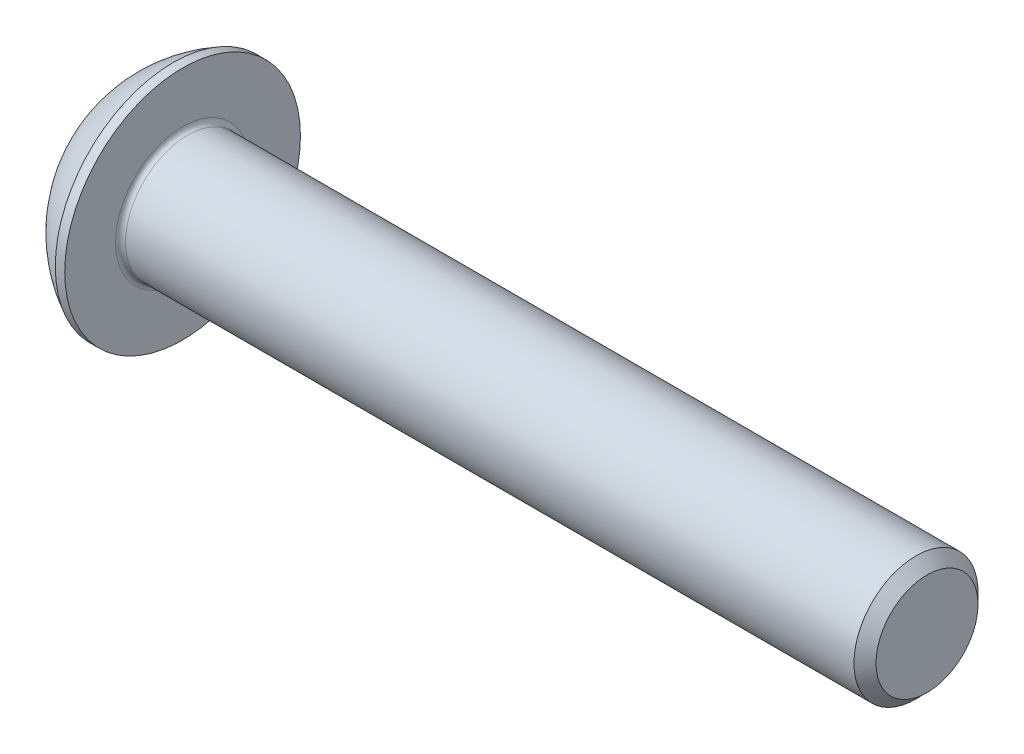
ISO-10303-21;
HEADER;
FILE_DESCRIPTION(('STEP AP214'),'2;1');
FILE_NAME('part.step','',(''),(''),'','','');
FILE_SCHEMA(('AUTOMOTIVE_DESIGN { 1 0 10303 214 1 1 1 1 }'));
ENDSEC;
DATA;
#1=APPLICATION_CONTEXT('core data for automotive mechanical design processes');
#2=APPLICATION_PROTOCOL_DEFINITION('international standard','automotive_design',2000,#1);
#3=PRODUCT_CONTEXT('',#1,'mechanical');
#4=PRODUCT('Part','Part','',(#3));
#5=PRODUCT_RELATED_PRODUCT_CATEGORY('part','',(#4));
#6=PRODUCT_DEFINITION_FORMATION('','',#4);
#7=PRODUCT_DEFINITION_CONTEXT('part definition',#1,'design');
#8=PRODUCT_DEFINITION('design','',#6,#7);
#9=PRODUCT_DEFINITION_SHAPE('','',#8);
#10=(LENGTH_UNIT() NAMED_UNIT(*) SI_UNIT(.MILLI.,.METRE.));
#11=(NAMED_UNIT(*) PLANE_ANGLE_UNIT() SI_UNIT($,.RADIAN.));
#12=(NAMED_UNIT(*) SI_UNIT($,.STERADIAN.) SOLID_ANGLE_UNIT());
#13=UNCERTAINTY_MEASURE_WITH_UNIT(LENGTH_MEASURE(1.E-05),#10,'distance_accuracy_value','');
#14=(GEOMETRIC_REPRESENTATION_CONTEXT(3) GLOBAL_UNCERTAINTY_ASSIGNED_CONTEXT((#13)) GLOBAL_UNIT_ASSIGNED_CONTEXT((#10,
#11,#12)) REPRESENTATION_CONTEXT('',''));
#15=CARTESIAN_POINT('',(0.,0.,0.));
#16=DIRECTION('',(0.,0.,1.));
#17=DIRECTION('',(1.,0.,0.));
#18=AXIS2_PLACEMENT_3D('',#15,#16,#17);
#19=CARTESIAN_POINT('',(0.,0.,0.));
#20=DIRECTION('',(-1.,0.,0.));
#21=DIRECTION('',(0.,0.,1.));
#22=AXIS2_PLACEMENT_3D('',#19,#20,#21);
#23=PLANE('',#22);
#24=CARTESIAN_POINT('',(0.,0.,0.));
#25=DIRECTION('',(-1.,0.,0.));
#26=DIRECTION('',(0.,0.,1.));
#27=AXIS2_PLACEMENT_3D('',#24,#25,#26);
#28=CIRCLE('',#27,2.375);
#29=CARTESIAN_POINT('',(0.,2.375,0.));
#30=VERTEX_POINT('',#29);
#31=EDGE_CURVE('E159',#30,#30,#28,.T.);
#32=ORIENTED_EDGE('',*,*,#31,.T.);
#33=EDGE_LOOP('',(#32));
#34=FACE_BOUND('',#33,.T.);
#35=DIRECTION('',(0.,-1.,0.));
#36=VECTOR('',#35,1.);
#37=CARTESIAN_POINT('',(0.,-0.866025403784438,1.5));
#38=LINE('',#37,#36);
#39=CARTESIAN_POINT('',(0.,0.86602540378444,1.5));
#40=VERTEX_POINT('',#39);
#41=CARTESIAN_POINT('',(0.,-0.866025403784438,1.5));
#42=VERTEX_POINT('',#41);
#43=EDGE_CURVE('E54',#40,#42,#38,.T.);
#44=ORIENTED_EDGE('',*,*,#43,.T.);
#45=DIRECTION('',(0.,-0.5,-0.866025403784439));
#46=VECTOR('',#45,1.);
#47=CARTESIAN_POINT('',(0.,-1.73205080756888,0.));
#48=LINE('',#47,#46);
#49=CARTESIAN_POINT('',(0.,-1.73205080756888,0.));
#50=VERTEX_POINT('',#49);
#51=EDGE_CURVE('E279',#42,#50,#48,.T.);
#52=ORIENTED_EDGE('',*,*,#51,.T.);
#53=DIRECTION('',(0.,0.5,-0.866025403784438));
#54=VECTOR('',#53,1.);
#55=CARTESIAN_POINT('',(0.,-0.866025403784438,-1.5));
#56=LINE('',#55,#54);
#57=CARTESIAN_POINT('',(0.,-0.866025403784438,-1.5));
#58=VERTEX_POINT('',#57);
#59=EDGE_CURVE('E134',#50,#58,#56,.T.);
#60=ORIENTED_EDGE('',*,*,#59,.T.);
#61=DIRECTION('',(0.,1.,0.));
#62=VECTOR('',#61,1.);
#63=CARTESIAN_POINT('',(0.,0.86602540378444,-1.5));
#64=LINE('',#63,#62);
#65=CARTESIAN_POINT('',(0.,0.86602540378444,-1.5));
#66=VERTEX_POINT('',#65);
#67=EDGE_CURVE('E282',#58,#66,#64,.T.);
#68=ORIENTED_EDGE('',*,*,#67,.T.);
#69=DIRECTION('',(0.,0.5,0.866025403784439));
#70=VECTOR('',#69,1.);
#71=CARTESIAN_POINT('',(0.,1.73205080756888,0.));
#72=LINE('',#71,#70);
#73=CARTESIAN_POINT('',(0.,1.73205080756888,0.));
#74=VERTEX_POINT('',#73);
#75=EDGE_CURVE('E284',#66,#74,#72,.T.);
#76=ORIENTED_EDGE('',*,*,#75,.T.);
#77=DIRECTION('',(0.,-0.5,0.866025403784439));
#78=VECTOR('',#77,1.);
#79=CARTESIAN_POINT('',(0.,0.86602540378444,1.5));
#80=LINE('',#79,#78);
#81=EDGE_CURVE('E286',#74,#40,#80,.T.);
#82=ORIENTED_EDGE('',*,*,#81,.T.);
#83=EDGE_LOOP('',(#44,#52,#60,#68,#76,#82));
#84=FACE_BOUND('',#83,.T.);
#85=ADVANCED_FACE('F39',(#34,#84),#23,.T.);
#86=CARTESIAN_POINT('',(4.75501582278481,0.,0.));
#87=DIRECTION('',(-1.,0.,0.));
#88=DIRECTION('',(0.,1.,0.));
#89=AXIS2_PLACEMENT_3D('',#86,#87,#88);
#90=SPHERICAL_SURFACE('',#89,5.3151482081814);
#91=CARTESIAN_POINT('',(2.37,0.,0.));
#92=DIRECTION('',(-1.,0.,0.));
#93=DIRECTION('',(0.,0.,1.));
#94=AXIS2_PLACEMENT_3D('',#91,#92,#93);
#95=CIRCLE('',#94,4.75);
#96=CARTESIAN_POINT('',(2.37,4.75,0.));
#97=VERTEX_POINT('',#96);
#98=EDGE_CURVE('E156',#97,#97,#95,.T.);
#99=CARTESIAN_POINT('',(2.37,4.75,0.));
#100=CARTESIAN_POINT('',(2.33822259048669,4.7340443473251,0.));
#101=CARTESIAN_POINT('',(2.30660534291523,4.71776971995817,0.));
#102=CARTESIAN_POINT('',(2.24370380094997,4.68458927158339,0.));
#103=CARTESIAN_POINT('',(2.21241950655618,4.66768345057554,0.));
#104=CARTESIAN_POINT('',(2.15019650024021,4.6332473706621,0.));
#105=CARTESIAN_POINT('',(2.11925778831804,4.6157171117565,0.));
#106=CARTESIAN_POINT('',(2.05773840110808,4.58003923142984,0.));
#107=CARTESIAN_POINT('',(2.02715772582028,4.56189161000878,0.));
#108=CARTESIAN_POINT('',(1.96636673145741,4.52498631044657,0.));
#109=CARTESIAN_POINT('',(1.93615641238234,4.50622863230541,0.));
#110=CARTESIAN_POINT('',(1.87611829826807,4.46811077571318,0.));
#111=CARTESIAN_POINT('',(1.84629050322888,4.4487505972621,0.));
#112=CARTESIAN_POINT('',(1.78702945162455,4.40943553782984,0.));
#113=CARTESIAN_POINT('',(1.75759619505941,4.38948065684865,0.));
#114=CARTESIAN_POINT('',(1.69913607574061,4.34898423002648,0.));
#115=CARTESIAN_POINT('',(1.67010921298694,4.32844268418548,0.));
#116=CARTESIAN_POINT('',(1.61247357298735,4.28678120152175,0.));
#117=CARTESIAN_POINT('',(1.58386479574144,4.265661264699,0.));
#118=CARTESIAN_POINT('',(1.52707685004032,4.22285150694424,0.));
#119=CARTESIAN_POINT('',(1.49889768158512,4.20116168601223,0.));
#120=CARTESIAN_POINT('',(1.44298030371049,4.15722089644741,0.));
#121=CARTESIAN_POINT('',(1.41524209429107,4.13496992781461,0.));
#122=CARTESIAN_POINT('',(1.36021780711889,4.08991580528235,0.));
#123=CARTESIAN_POINT('',(1.33293172936613,4.06711265138288,0.));
#124=CARTESIAN_POINT('',(1.278822696045,4.02096334316477,0.));
#125=CARTESIAN_POINT('',(1.25199974047662,3.99761718884614,0.));
#126=CARTESIAN_POINT('',(1.19882775550162,3.95039128335163,0.));
#127=CARTESIAN_POINT('',(1.172478726095,3.92651153217576,0.));
#128=CARTESIAN_POINT('',(1.1202652065289,3.87822805145535,0.));
#129=CARTESIAN_POINT('',(1.09440071636942,3.85382432191081,0.));
#130=CARTESIAN_POINT('',(1.04316669321618,3.8045027139941,0.));
#131=CARTESIAN_POINT('',(1.01779716022241,3.77958483562192,0.));
#132=CARTESIAN_POINT('',(0.9675632699561,3.72924496668416,0.));
#133=CARTESIAN_POINT('',(0.942698912683562,3.70382297611859,0.));
#134=CARTESIAN_POINT('',(0.89348538893628,3.65248512247887,0.));
#135=CARTESIAN_POINT('',(0.869136222461536,3.62656925940472,0.));
#136=CARTESIAN_POINT('',(0.82096288787349,3.57425409935884,0.));
#137=CARTESIAN_POINT('',(0.797138719760188,3.54785480238711,0.));
#138=CARTESIAN_POINT('',(0.750024977995378,3.49458340787865,0.));
#139=CARTESIAN_POINT('',(0.726735404343869,3.46771131034191,0.));
#140=CARTESIAN_POINT('',(0.680700232274541,3.41350513847464,0.));
#141=CARTESIAN_POINT('',(0.657954633856721,3.3861710641441,0.));
#142=CARTESIAN_POINT('',(0.613016573919583,3.33105194853939,0.));
#143=CARTESIAN_POINT('',(0.590824112400263,3.30326690726522,0.));
#144=CARTESIAN_POINT('',(0.547001265128254,3.24725704926748,0.));
#145=CARTESIAN_POINT('',(0.525370879375564,3.21903223254391,0.));
#146=CARTESIAN_POINT('',(0.48268089610549,3.16215419227901,0.));
#147=CARTESIAN_POINT('',(0.461621298588105,3.13350096873769,0.));
#148=CARTESIAN_POINT('',(0.420081374357154,3.07577765602272,0.));
#149=CARTESIAN_POINT('',(0.399601047643587,3.04670756684908,0.));
#150=CARTESIAN_POINT('',(0.359227914239947,2.98816223197683,0.));
#151=CARTESIAN_POINT('',(0.339335107549873,2.95868698627821,0.));
#152=CARTESIAN_POINT('',(0.300145026860787,2.89934321060632,0.));
#153=CARTESIAN_POINT('',(0.280847752861776,2.86947468063304,0.));
#154=CARTESIAN_POINT('',(0.242856509997139,2.80935636725696,0.));
#155=CARTESIAN_POINT('',(0.224162541131514,2.77910658385416,0.));
#156=CARTESIAN_POINT('',(0.187385439283607,2.71823794734018,0.));
#157=CARTESIAN_POINT('',(0.169302306301325,2.68761909422898,0.));
#158=CARTESIAN_POINT('',(0.133754156035989,2.626024653246,0.));
#159=CARTESIAN_POINT('',(0.116289138752934,2.59504906537422,0.));
#160=CARTESIAN_POINT('',(0.081984269005742,2.53275362391635,0.));
#161=CARTESIAN_POINT('',(0.0651444165416041,2.50143377033028,0.));
#162=CARTESIAN_POINT('',(0.03209660554443,2.43846244094735,0.));
#163=CARTESIAN_POINT('',(0.0158886470113938,2.40681096515049,0.));
#164=CARTESIAN_POINT('',(0.,2.375,0.));
#165=B_SPLINE_CURVE_WITH_KNOTS('',3,(#99,#100,#101,#102,#103,#104,#105,#106,#107,#108,#109,#110,
#111,#112,#113,#114,#115,#116,#117,#118,#119,#120,#121,#122,#123,#124,#125,#126,#127,#128,#129,
#130,#131,#132,#133,#134,#135,#136,#137,#138,#139,#140,#141,#142,#143,#144,#145,#146,#147,#148,
#149,#150,#151,#152,#153,#154,#155,#156,#157,#158,#159,#160,#161,#162,#163,#164),.UNSPECIFIED.,
.F.,.F.,(4,2,2,2,2,2,2,2,2,2,2,2,2,2,2,2,2,2,2,2,2,2,2,2,2,2,2,2,2,2,2,2,4),(0.,
0.106672849678272,0.213345699356545,0.320018549034817,0.426691398713089,0.533364248391363,
0.640037098069634,0.746709947747907,0.853382797426179,0.960055647104452,1.06672849678272,
1.173401346461,1.28007419613927,1.38674704581754,1.49341989549581,1.60009274517409,
1.70676559485236,1.81343844453063,1.9201112942089,2.02678414388718,2.13345699356545,
2.24012984324372,2.34680269292199,2.45347554260027,2.56014839227854,2.66682124195681,
2.77349409163508,2.88016694131336,2.98683979099163,3.0935126406699,3.20018549034817,
3.30685834002645,3.41353118970472),.UNSPECIFIED.);
#166=EDGE_CURVE('BSEAM180',#97,#30,#165,.T.);
#167=ORIENTED_EDGE('',*,*,#98,.T.);
#168=ORIENTED_EDGE('',*,*,#31,.F.);
#169=ORIENTED_EDGE('',*,*,#166,.T.);
#170=ORIENTED_EDGE('',*,*,#166,.F.);
#171=EDGE_LOOP('',(#167,#169,#168,#170));
#172=FACE_BOUND('',#171,.T.);
#173=ADVANCED_FACE('F180',(#172),#90,.T.);
#174=CARTESIAN_POINT('',(0.,0.,0.));
#175=DIRECTION('',(-1.,0.,0.));
#176=DIRECTION('',(0.,0.,1.));
#177=AXIS2_PLACEMENT_3D('',#174,#175,#176);
#178=CYLINDRICAL_SURFACE('',#177,4.75);
#179=ORIENTED_EDGE('',*,*,#98,.F.);
#180=EDGE_LOOP('',(#179));
#181=FACE_BOUND('',#180,.T.);
#182=CARTESIAN_POINT('',(2.75,0.,0.));
#183=DIRECTION('',(-1.,0.,0.));
#184=DIRECTION('',(0.,0.,1.));
#185=AXIS2_PLACEMENT_3D('',#182,#183,#184);
#186=CIRCLE('',#185,4.75);
#187=CARTESIAN_POINT('',(2.75,0.,4.75));
#188=VERTEX_POINT('',#187);
#189=EDGE_CURVE('E153',#188,#188,#186,.T.);
#190=ORIENTED_EDGE('',*,*,#189,.T.);
#191=EDGE_LOOP('',(#190));
#192=FACE_BOUND('',#191,.T.);
#193=ADVANCED_FACE('F185',(#181,#192),#178,.T.);
#194=CARTESIAN_POINT('',(2.75,2.49999999999999,0.));
#195=DIRECTION('',(-1.,0.,0.));
#196=DIRECTION('',(0.,0.,1.));
#197=AXIS2_PLACEMENT_3D('',#194,#195,#196);
#198=PLANE('',#197);
#199=CARTESIAN_POINT('',(2.75,0.,0.));
#200=DIRECTION('',(-1.,0.,0.));
#201=DIRECTION('',(0.,0.,1.));
#202=AXIS2_PLACEMENT_3D('',#199,#200,#201);
#203=CIRCLE('',#202,2.7);
#204=CARTESIAN_POINT('',(2.75,0.,2.7));
#205=VERTEX_POINT('',#204);
#206=EDGE_CURVE('E47',#205,#205,#203,.T.);
#207=ORIENTED_EDGE('',*,*,#206,.T.);
#208=EDGE_LOOP('',(#207));
#209=FACE_BOUND('',#208,.T.);
#210=ORIENTED_EDGE('',*,*,#189,.F.);
#211=EDGE_LOOP('',(#210));
#212=FACE_BOUND('',#211,.T.);
#213=ADVANCED_FACE('F164',(#209,#212),#198,.F.);
#214=CARTESIAN_POINT('',(0.,0.,0.));
#215=DIRECTION('',(-1.,0.,0.));
#216=DIRECTION('',(0.,0.,1.));
#217=AXIS2_PLACEMENT_3D('',#214,#215,#216);
#218=CYLINDRICAL_SURFACE('',#217,2.5);
#219=CARTESIAN_POINT('',(2.95,0.,0.));
#220=DIRECTION('',(-1.,0.,0.));
#221=DIRECTION('',(0.,0.,1.));
#222=AXIS2_PLACEMENT_3D('',#219,#220,#221);
#223=CIRCLE('',#222,2.5);
#224=CARTESIAN_POINT('',(2.95,0.,2.5));
#225=VERTEX_POINT('',#224);
#226=EDGE_CURVE('E11',#225,#225,#223,.F.);
#227=ORIENTED_EDGE('',*,*,#226,.T.);
#228=EDGE_LOOP('',(#227));
#229=FACE_BOUND('',#228,.T.);
#230=CARTESIAN_POINT('',(32.305,0.,0.));
#231=DIRECTION('',(-1.,0.,0.));
#232=DIRECTION('',(0.,0.,1.));
#233=AXIS2_PLACEMENT_3D('',#230,#231,#232);
#234=CIRCLE('',#233,2.5);
#235=CARTESIAN_POINT('',(32.305,0.,2.5));
#236=VERTEX_POINT('',#235);
#237=EDGE_CURVE('E150',#236,#236,#234,.T.);
#238=ORIENTED_EDGE('',*,*,#237,.T.);
#239=EDGE_LOOP('',(#238));
#240=FACE_BOUND('',#239,.T.);
#241=ADVANCED_FACE('F194',(#229,#240),#218,.T.);
#242=CARTESIAN_POINT('',(32.75,0.,0.));
#243=DIRECTION('',(-1.,0.,0.));
#244=DIRECTION('',(0.,0.,1.));
#245=AXIS2_PLACEMENT_3D('',#242,#243,#244);
#246=CONICAL_SURFACE('',#245,2.055,0.785398163397436);
#247=ORIENTED_EDGE('',*,*,#237,.F.);
#248=EDGE_LOOP('',(#247));
#249=FACE_BOUND('',#248,.T.);
#250=CARTESIAN_POINT('',(32.75,0.,0.));
#251=DIRECTION('',(-1.,0.,0.));
#252=DIRECTION('',(0.,0.,1.));
#253=AXIS2_PLACEMENT_3D('',#250,#251,#252);
#254=CIRCLE('',#253,2.055);
#255=CARTESIAN_POINT('',(32.75,0.,2.055));
#256=VERTEX_POINT('',#255);
#257=EDGE_CURVE('E146',#256,#256,#254,.T.);
#258=ORIENTED_EDGE('',*,*,#257,.T.);
#259=EDGE_LOOP('',(#258));
#260=FACE_BOUND('',#259,.T.);
#261=ADVANCED_FACE('F175',(#249,#260),#246,.T.);
#262=CARTESIAN_POINT('',(32.75,0.,0.));
#263=DIRECTION('',(-1.,0.,0.));
#264=DIRECTION('',(0.,0.,1.));
#265=AXIS2_PLACEMENT_3D('',#262,#263,#264);
#266=PLANE('',#265);
#267=ORIENTED_EDGE('',*,*,#257,.F.);
#268=EDGE_LOOP('',(#267));
#269=FACE_BOUND('',#268,.T.);
#270=ADVANCED_FACE('F168',(#269),#266,.F.);
#271=CARTESIAN_POINT('',(2.95,0.,0.));
#272=DIRECTION('',(-1.,0.,0.));
#273=DIRECTION('',(0.,0.,1.));
#274=AXIS2_PLACEMENT_3D('',#271,#272,#273);
#275=TOROIDAL_SURFACE('',#274,2.7,0.2);
#276=ORIENTED_EDGE('',*,*,#226,.F.);
#277=EDGE_LOOP('',(#276));
#278=FACE_BOUND('',#277,.T.);
#279=ORIENTED_EDGE('',*,*,#206,.F.);
#280=EDGE_LOOP('',(#279));
#281=FACE_BOUND('',#280,.T.);
#282=ADVANCED_FACE('F41',(#278,#281),#275,.F.);
#283=CARTESIAN_POINT('',(1.56,-1.73205080756888,0.));
#284=DIRECTION('',(0.,0.866025403784438,-0.5));
#285=DIRECTION('',(0.,0.5,0.866025403784439));
#286=AXIS2_PLACEMENT_3D('',#283,#284,#285);
#287=PLANE('',#286);
#288=DIRECTION('',(0.,-0.5,-0.866025403784439));
#289=VECTOR('',#288,1.);
#290=CARTESIAN_POINT('',(1.56,-1.73205080756888,0.));
#291=LINE('',#290,#289);
#292=CARTESIAN_POINT('',(1.56,-0.866025403784438,1.5));
#293=VERTEX_POINT('',#292);
#294=CARTESIAN_POINT('',(1.56,-1.29903810567666,0.75));
#295=VERTEX_POINT('',#294);
#296=EDGE_CURVE('E120',#293,#295,#291,.T.);
#297=ORIENTED_EDGE('',*,*,#296,.T.);
#298=CARTESIAN_POINT('',(1.56,-1.73205080756888,0.));
#299=VERTEX_POINT('',#298);
#300=EDGE_CURVE('E115',#295,#299,#291,.T.);
#301=ORIENTED_EDGE('',*,*,#300,.T.);
#302=DIRECTION('',(-1.,0.,0.));
#303=VECTOR('',#302,1.);
#304=CARTESIAN_POINT('',(1.56,-1.73205080756888,0.));
#305=LINE('',#304,#303);
#306=EDGE_CURVE('E117',#299,#50,#305,.T.);
#307=ORIENTED_EDGE('',*,*,#306,.T.);
#308=ORIENTED_EDGE('',*,*,#51,.F.);
#309=DIRECTION('',(-1.,0.,0.));
#310=VECTOR('',#309,1.);
#311=CARTESIAN_POINT('',(1.56,-0.866025403784438,1.5));
#312=LINE('',#311,#310);
#313=EDGE_CURVE('E275',#293,#42,#312,.T.);
#314=ORIENTED_EDGE('',*,*,#313,.F.);
#315=EDGE_LOOP('',(#297,#301,#307,#308,#314));
#316=FACE_BOUND('',#315,.T.);
#317=ADVANCED_FACE('F116',(#316),#287,.T.);
#318=CARTESIAN_POINT('',(1.56,-0.866025403784438,-1.5));
#319=DIRECTION('',(0.,0.866025403784438,0.5));
#320=DIRECTION('',(0.,-0.5,0.866025403784439));
#321=AXIS2_PLACEMENT_3D('',#318,#319,#320);
#322=PLANE('',#321);
#323=DIRECTION('',(0.,0.5,-0.866025403784438));
#324=VECTOR('',#323,1.);
#325=CARTESIAN_POINT('',(1.56,-0.866025403784438,-1.5));
#326=LINE('',#325,#324);
#327=CARTESIAN_POINT('',(1.56,-1.29903810567666,-0.75));
#328=VERTEX_POINT('',#327);
#329=EDGE_CURVE('E62',#299,#328,#326,.T.);
#330=ORIENTED_EDGE('',*,*,#329,.T.);
#331=CARTESIAN_POINT('',(1.56,-0.866025403784438,-1.5));
#332=VERTEX_POINT('',#331);
#333=EDGE_CURVE('E129',#328,#332,#326,.T.);
#334=ORIENTED_EDGE('',*,*,#333,.T.);
#335=DIRECTION('',(-1.,0.,0.));
#336=VECTOR('',#335,1.);
#337=CARTESIAN_POINT('',(1.56,-0.866025403784438,-1.5));
#338=LINE('',#337,#336);
#339=EDGE_CURVE('E136',#332,#58,#338,.T.);
#340=ORIENTED_EDGE('',*,*,#339,.T.);
#341=ORIENTED_EDGE('',*,*,#59,.F.);
#342=ORIENTED_EDGE('',*,*,#306,.F.);
#343=EDGE_LOOP('',(#330,#334,#340,#341,#342));
#344=FACE_BOUND('',#343,.T.);
#345=ADVANCED_FACE('F132',(#344),#322,.T.);
#346=CARTESIAN_POINT('',(1.56,0.86602540378444,-1.5));
#347=DIRECTION('',(0.,0.,1.));
#348=DIRECTION('',(0.,-1.,0.));
#349=AXIS2_PLACEMENT_3D('',#346,#347,#348);
#350=PLANE('',#349);
#351=DIRECTION('',(0.,1.,0.));
#352=VECTOR('',#351,1.);
#353=CARTESIAN_POINT('',(1.56,0.86602540378444,-1.5));
#354=LINE('',#353,#352);
#355=CARTESIAN_POINT('',(1.56,0.,-1.5));
#356=VERTEX_POINT('',#355);
#357=EDGE_CURVE('E256',#332,#356,#354,.T.);
#358=ORIENTED_EDGE('',*,*,#357,.T.);
#359=CARTESIAN_POINT('',(1.56,0.86602540378444,-1.5));
#360=VERTEX_POINT('',#359);
#361=EDGE_CURVE('E128',#356,#360,#354,.T.);
#362=ORIENTED_EDGE('',*,*,#361,.T.);
#363=DIRECTION('',(-1.,0.,0.));
#364=VECTOR('',#363,1.);
#365=CARTESIAN_POINT('',(1.56,0.86602540378444,-1.5));
#366=LINE('',#365,#364);
#367=EDGE_CURVE('E141',#360,#66,#366,.T.);
#368=ORIENTED_EDGE('',*,*,#367,.T.);
#369=ORIENTED_EDGE('',*,*,#67,.F.);
#370=ORIENTED_EDGE('',*,*,#339,.F.);
#371=EDGE_LOOP('',(#358,#362,#368,#369,#370));
#372=FACE_BOUND('',#371,.T.);
#373=ADVANCED_FACE('F208',(#372),#350,.T.);
#374=CARTESIAN_POINT('',(1.56,1.73205080756888,0.));
#375=DIRECTION('',(0.,-0.866025403784439,0.5));
#376=DIRECTION('',(0.,-0.5,-0.866025403784439));
#377=AXIS2_PLACEMENT_3D('',#374,#375,#376);
#378=PLANE('',#377);
#379=DIRECTION('',(0.,0.5,0.866025403784439));
#380=VECTOR('',#379,1.);
#381=CARTESIAN_POINT('',(1.56,1.73205080756888,0.));
#382=LINE('',#381,#380);
#383=CARTESIAN_POINT('',(1.56,1.29903810567666,-0.750000000000001));
#384=VERTEX_POINT('',#383);
#385=EDGE_CURVE('E245',#360,#384,#382,.T.);
#386=ORIENTED_EDGE('',*,*,#385,.T.);
#387=CARTESIAN_POINT('',(1.56,1.73205080756888,0.));
#388=VERTEX_POINT('',#387);
#389=EDGE_CURVE('E250',#384,#388,#382,.T.);
#390=ORIENTED_EDGE('',*,*,#389,.T.);
#391=DIRECTION('',(-1.,0.,0.));
#392=VECTOR('',#391,1.);
#393=CARTESIAN_POINT('',(1.56,1.73205080756888,0.));
#394=LINE('',#393,#392);
#395=EDGE_CURVE('E290',#388,#74,#394,.T.);
#396=ORIENTED_EDGE('',*,*,#395,.T.);
#397=ORIENTED_EDGE('',*,*,#75,.F.);
#398=ORIENTED_EDGE('',*,*,#367,.F.);
#399=EDGE_LOOP('',(#386,#390,#396,#397,#398));
#400=FACE_BOUND('',#399,.T.);
#401=ADVANCED_FACE('F211',(#400),#378,.T.);
#402=CARTESIAN_POINT('',(1.56,0.86602540378444,1.5));
#403=DIRECTION('',(0.,-0.866025403784439,-0.5));
#404=DIRECTION('',(0.,0.5,-0.866025403784439));
#405=AXIS2_PLACEMENT_3D('',#402,#403,#404);
#406=PLANE('',#405);
#407=DIRECTION('',(0.,-0.5,0.866025403784439));
#408=VECTOR('',#407,1.);
#409=CARTESIAN_POINT('',(1.56,0.86602540378444,1.5));
#410=LINE('',#409,#408);
#411=CARTESIAN_POINT('',(1.56,1.29903810567666,0.75));
#412=VERTEX_POINT('',#411);
#413=EDGE_CURVE('E253',#388,#412,#410,.T.);
#414=ORIENTED_EDGE('',*,*,#413,.T.);
#415=CARTESIAN_POINT('',(1.56,0.86602540378444,1.5));
#416=VERTEX_POINT('',#415);
#417=EDGE_CURVE('E261',#412,#416,#410,.T.);
#418=ORIENTED_EDGE('',*,*,#417,.T.);
#419=DIRECTION('',(-1.,0.,0.));
#420=VECTOR('',#419,1.);
#421=CARTESIAN_POINT('',(1.56,0.86602540378444,1.5));
#422=LINE('',#421,#420);
#423=EDGE_CURVE('E274',#416,#40,#422,.T.);
#424=ORIENTED_EDGE('',*,*,#423,.T.);
#425=ORIENTED_EDGE('',*,*,#81,.F.);
#426=ORIENTED_EDGE('',*,*,#395,.F.);
#427=EDGE_LOOP('',(#414,#418,#424,#425,#426));
#428=FACE_BOUND('',#427,.T.);
#429=ADVANCED_FACE('F215',(#428),#406,.T.);
#430=CARTESIAN_POINT('',(1.56,-0.866025403784438,1.5));
#431=DIRECTION('',(0.,0.,-1.));
#432=DIRECTION('',(0.,1.,0.));
#433=AXIS2_PLACEMENT_3D('',#430,#431,#432);
#434=PLANE('',#433);
#435=DIRECTION('',(0.,-1.,0.));
#436=VECTOR('',#435,1.);
#437=CARTESIAN_POINT('',(1.56,-0.866025403784438,1.5));
#438=LINE('',#437,#436);
#439=CARTESIAN_POINT('',(1.56,0.,1.5));
#440=VERTEX_POINT('',#439);
#441=EDGE_CURVE('E267',#416,#440,#438,.T.);
#442=ORIENTED_EDGE('',*,*,#441,.T.);
#443=EDGE_CURVE('E269',#440,#293,#438,.T.);
#444=ORIENTED_EDGE('',*,*,#443,.T.);
#445=ORIENTED_EDGE('',*,*,#313,.T.);
#446=ORIENTED_EDGE('',*,*,#43,.F.);
#447=ORIENTED_EDGE('',*,*,#423,.F.);
#448=EDGE_LOOP('',(#442,#444,#445,#446,#447));
#449=FACE_BOUND('',#448,.T.);
#450=ADVANCED_FACE('F219',(#449),#434,.T.);
#451=CARTESIAN_POINT('',(1.56,-1.73205080756888,0.));
#452=DIRECTION('',(1.,0.,0.));
#453=DIRECTION('',(0.,0.,-1.));
#454=AXIS2_PLACEMENT_3D('',#451,#452,#453);
#455=PLANE('',#454);
#456=CARTESIAN_POINT('',(1.56,0.,0.));
#457=DIRECTION('',(-1.,0.,0.));
#458=DIRECTION('',(0.,0.,1.));
#459=AXIS2_PLACEMENT_3D('',#456,#457,#458);
#460=CIRCLE('',#459,1.5);
#461=EDGE_CURVE('E242',#384,#356,#460,.T.);
#462=ORIENTED_EDGE('',*,*,#461,.F.);
#463=ORIENTED_EDGE('',*,*,#385,.F.);
#464=ORIENTED_EDGE('',*,*,#361,.F.);
#465=EDGE_LOOP('',(#462,#463,#464));
#466=FACE_BOUND('',#465,.T.);
#467=ADVANCED_FACE('F223',(#466),#455,.F.);
#468=EDGE_CURVE('E147',#412,#384,#460,.T.);
#469=ORIENTED_EDGE('',*,*,#468,.F.);
#470=ORIENTED_EDGE('',*,*,#413,.F.);
#471=ORIENTED_EDGE('',*,*,#389,.F.);
#472=EDGE_LOOP('',(#469,#470,#471));
#473=FACE_BOUND('',#472,.T.);
#474=ADVANCED_FACE('F232',(#473),#455,.F.);
#475=EDGE_CURVE('E140',#440,#412,#460,.T.);
#476=ORIENTED_EDGE('',*,*,#475,.F.);
#477=ORIENTED_EDGE('',*,*,#441,.F.);
#478=ORIENTED_EDGE('',*,*,#417,.F.);
#479=EDGE_LOOP('',(#476,#477,#478));
#480=FACE_BOUND('',#479,.T.);
#481=ADVANCED_FACE('F237',(#480),#455,.F.);
#482=EDGE_CURVE('E135',#295,#440,#460,.T.);
#483=ORIENTED_EDGE('',*,*,#482,.F.);
#484=ORIENTED_EDGE('',*,*,#296,.F.);
#485=ORIENTED_EDGE('',*,*,#443,.F.);
#486=EDGE_LOOP('',(#483,#484,#485));
#487=FACE_BOUND('',#486,.T.);
#488=ADVANCED_FACE('F230',(#487),#455,.F.);
#489=EDGE_CURVE('E126',#328,#295,#460,.T.);
#490=ORIENTED_EDGE('',*,*,#489,.F.);
#491=ORIENTED_EDGE('',*,*,#329,.F.);
#492=ORIENTED_EDGE('',*,*,#300,.F.);
#493=EDGE_LOOP('',(#490,#491,#492));
#494=FACE_BOUND('',#493,.T.);
#495=ADVANCED_FACE('F125',(#494),#455,.F.);
#496=EDGE_CURVE('E248',#356,#328,#460,.T.);
#497=ORIENTED_EDGE('',*,*,#496,.F.);
#498=ORIENTED_EDGE('',*,*,#357,.F.);
#499=ORIENTED_EDGE('',*,*,#333,.F.);
#500=EDGE_LOOP('',(#497,#498,#499));
#501=FACE_BOUND('',#500,.T.);
#502=ADVANCED_FACE('F203',(#501),#455,.F.);
#503=CARTESIAN_POINT('',(2.42602540378445,0.,0.));
#504=DIRECTION('',(-1.,0.,0.));
#505=DIRECTION('',(0.,0.,1.));
#506=AXIS2_PLACEMENT_3D('',#503,#504,#505);
#507=CONICAL_SURFACE('',#506,0.,1.04719755119659);
#508=ORIENTED_EDGE('',*,*,#475,.T.);
#509=ORIENTED_EDGE('',*,*,#468,.T.);
#510=ORIENTED_EDGE('',*,*,#461,.T.);
#511=ORIENTED_EDGE('',*,*,#496,.T.);
#512=ORIENTED_EDGE('',*,*,#489,.T.);
#513=ORIENTED_EDGE('',*,*,#482,.T.);
#514=EDGE_LOOP('',(#508,#509,#510,#511,#512,#513));
#515=FACE_BOUND('',#514,.T.);
#516=CARTESIAN_POINT('',(2.42602540378445,0.,0.));
#517=VERTEX_POINT('',#516);
#518=VERTEX_LOOP('',#517);
#519=FACE_BOUND('',#518,.T.);
#520=ADVANCED_FACE('F201',(#515,#519),#507,.F.);
#521=CLOSED_SHELL('',(#85,#173,#193,#213,#241,#261,#270,#282,#317,#345,#373,#401,#429,#450,#467,
#474,#481,#488,#495,#502,#520));
#522=MANIFOLD_SOLID_BREP('B2',#521);
#523=ADVANCED_BREP_SHAPE_REPRESENTATION('',(#18,#522),#14);
#524=SHAPE_DEFINITION_REPRESENTATION(#9,#523);
ENDSEC;
END-ISO-10303-21;
